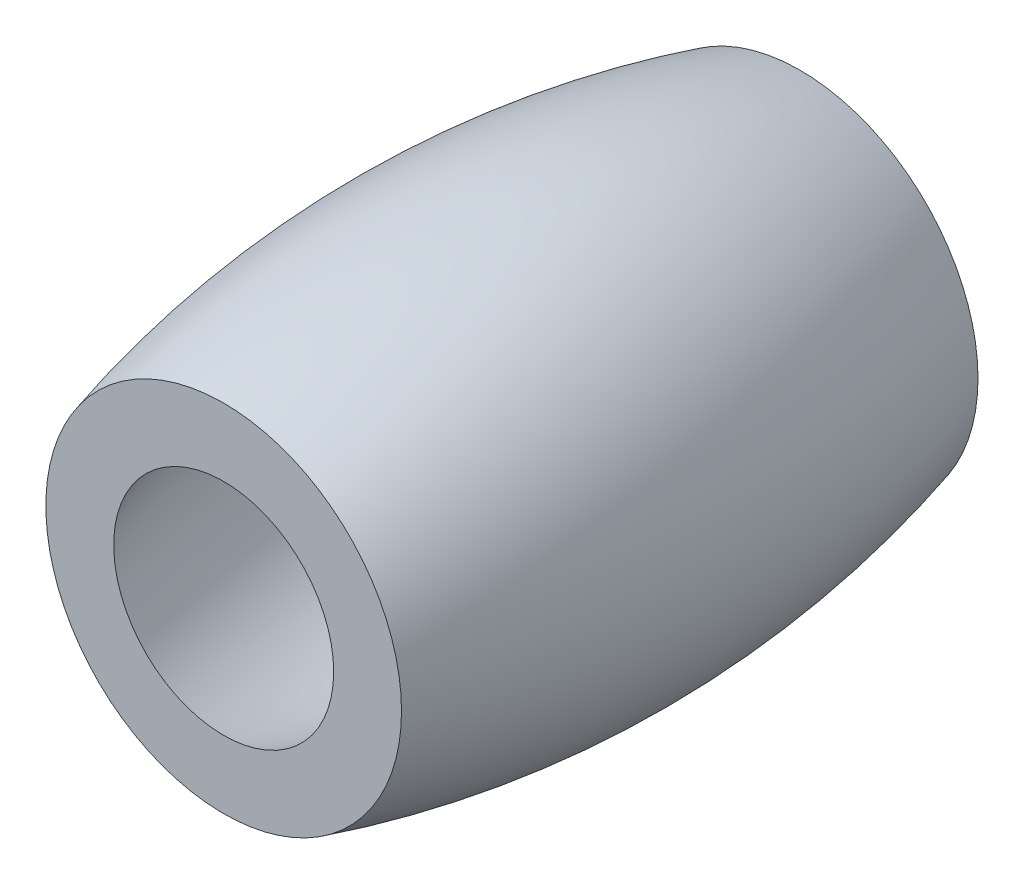
ISO-10303-21;
HEADER;
FILE_DESCRIPTION(('STEP AP214'),'2;1');
FILE_NAME('part.step','',(''),(''),'','','');
FILE_SCHEMA(('AUTOMOTIVE_DESIGN { 1 0 10303 214 1 1 1 1 }'));
ENDSEC;
DATA;
#1=APPLICATION_CONTEXT('core data for automotive mechanical design processes');
#2=APPLICATION_PROTOCOL_DEFINITION('international standard','automotive_design',2000,#1);
#3=PRODUCT_CONTEXT('',#1,'mechanical');
#4=PRODUCT('Part','Part','',(#3));
#5=PRODUCT_RELATED_PRODUCT_CATEGORY('part','',(#4));
#6=PRODUCT_DEFINITION_FORMATION('','',#4);
#7=PRODUCT_DEFINITION_CONTEXT('part definition',#1,'design');
#8=PRODUCT_DEFINITION('design','',#6,#7);
#9=PRODUCT_DEFINITION_SHAPE('','',#8);
#10=(LENGTH_UNIT() NAMED_UNIT(*) SI_UNIT(.MILLI.,.METRE.));
#11=(NAMED_UNIT(*) PLANE_ANGLE_UNIT() SI_UNIT($,.RADIAN.));
#12=(NAMED_UNIT(*) SI_UNIT($,.STERADIAN.) SOLID_ANGLE_UNIT());
#13=UNCERTAINTY_MEASURE_WITH_UNIT(LENGTH_MEASURE(1.E-05),#10,'distance_accuracy_value','');
#14=(GEOMETRIC_REPRESENTATION_CONTEXT(3) GLOBAL_UNCERTAINTY_ASSIGNED_CONTEXT((#13)) GLOBAL_UNIT_ASSIGNED_CONTEXT((#10,
#11,#12)) REPRESENTATION_CONTEXT('',''));
#15=CARTESIAN_POINT('',(0.,0.,0.));
#16=DIRECTION('',(0.,0.,1.));
#17=DIRECTION('',(1.,0.,0.));
#18=AXIS2_PLACEMENT_3D('',#15,#16,#17);
#19=CARTESIAN_POINT('',(0.,25.43,0.));
#20=DIRECTION('',(0.,0.,1.));
#21=DIRECTION('',(1.,0.,0.));
#22=AXIS2_PLACEMENT_3D('',#19,#20,#21);
#23=DEGENERATE_TOROIDAL_SURFACE('',#22,25.4300000000001,31.8300000000001,.F.);
#24=CARTESIAN_POINT('',(0.,25.43,8.50000000000001));
#25=DIRECTION('',(0.,0.,1.));
#26=DIRECTION('',(1.,0.,0.));
#27=AXIS2_PLACEMENT_3D('',#24,#25,#26);
#28=CIRCLE('',#27,5.24407537318769);
#29=CARTESIAN_POINT('',(5.24407537318769,25.43,8.50000000000001));
#30=VERTEX_POINT('',#29);
#31=EDGE_CURVE('E56',#30,#30,#28,.T.);
#32=ORIENTED_EDGE('',*,*,#31,.F.);
#33=EDGE_LOOP('',(#32));
#34=FACE_BOUND('',#33,.T.);
#35=CARTESIAN_POINT('',(0.,25.43,-8.49999999999999));
#36=DIRECTION('',(0.,0.,1.));
#37=DIRECTION('',(1.,0.,0.));
#38=AXIS2_PLACEMENT_3D('',#35,#36,#37);
#39=CIRCLE('',#38,5.24407537318769);
#40=CARTESIAN_POINT('',(5.24407537318769,25.43,-8.49999999999999));
#41=VERTEX_POINT('',#40);
#42=EDGE_CURVE('E12',#41,#41,#39,.T.);
#43=ORIENTED_EDGE('',*,*,#42,.T.);
#44=EDGE_LOOP('',(#43));
#45=FACE_BOUND('',#44,.T.);
#46=ADVANCED_FACE('F42',(#34,#45),#23,.F.);
#47=CARTESIAN_POINT('',(0.,30.6740753731877,-8.49999999999999));
#48=DIRECTION('',(0.,0.,1.));
#49=DIRECTION('',(1.,0.,0.));
#50=AXIS2_PLACEMENT_3D('',#47,#48,#49);
#51=PLANE('',#50);
#52=ORIENTED_EDGE('',*,*,#42,.F.);
#53=EDGE_LOOP('',(#52));
#54=FACE_BOUND('',#53,.T.);
#55=CARTESIAN_POINT('',(0.,25.43,-8.49999999999999));
#56=DIRECTION('',(0.,0.,1.));
#57=DIRECTION('',(1.,0.,0.));
#58=AXIS2_PLACEMENT_3D('',#55,#56,#57);
#59=CIRCLE('',#58,3.24407537318769);
#60=CARTESIAN_POINT('',(3.24407537318769,25.43,-8.49999999999999));
#61=VERTEX_POINT('',#60);
#62=EDGE_CURVE('E48',#61,#61,#59,.T.);
#63=ORIENTED_EDGE('',*,*,#62,.T.);
#64=EDGE_LOOP('',(#63));
#65=FACE_BOUND('',#64,.T.);
#66=ADVANCED_FACE('F65',(#54,#65),#51,.F.);
#67=CARTESIAN_POINT('',(0.,25.43,0.));
#68=DIRECTION('',(0.,0.,1.));
#69=DIRECTION('',(1.,0.,0.));
#70=AXIS2_PLACEMENT_3D('',#67,#68,#69);
#71=DEGENERATE_TOROIDAL_SURFACE('',#70,27.4299999999997,31.8299999999997,.F.);
#72=ORIENTED_EDGE('',*,*,#62,.F.);
#73=EDGE_LOOP('',(#72));
#74=FACE_BOUND('',#73,.T.);
#75=CARTESIAN_POINT('',(0.,25.43,8.50000000000001));
#76=DIRECTION('',(0.,0.,1.));
#77=DIRECTION('',(1.,0.,0.));
#78=AXIS2_PLACEMENT_3D('',#75,#76,#77);
#79=CIRCLE('',#78,3.24407537318768);
#80=CARTESIAN_POINT('',(3.24407537318768,25.43,8.50000000000001));
#81=VERTEX_POINT('',#80);
#82=EDGE_CURVE('E52',#81,#81,#79,.T.);
#83=ORIENTED_EDGE('',*,*,#82,.T.);
#84=EDGE_LOOP('',(#83));
#85=FACE_BOUND('',#84,.T.);
#86=ADVANCED_FACE('F69',(#74,#85),#71,.T.);
#87=CARTESIAN_POINT('',(0.,28.6740753731877,8.50000000000001));
#88=DIRECTION('',(0.,0.,-1.));
#89=DIRECTION('',(-1.,0.,0.));
#90=AXIS2_PLACEMENT_3D('',#87,#88,#89);
#91=PLANE('',#90);
#92=ORIENTED_EDGE('',*,*,#82,.F.);
#93=EDGE_LOOP('',(#92));
#94=FACE_BOUND('',#93,.T.);
#95=ORIENTED_EDGE('',*,*,#31,.T.);
#96=EDGE_LOOP('',(#95));
#97=FACE_BOUND('',#96,.T.);
#98=ADVANCED_FACE('F62',(#94,#97),#91,.F.);
#99=CLOSED_SHELL('',(#46,#66,#86,#98));
#100=MANIFOLD_SOLID_BREP('B2',#99);
#101=ADVANCED_BREP_SHAPE_REPRESENTATION('',(#18,#100),#14);
#102=SHAPE_DEFINITION_REPRESENTATION(#9,#101);
ENDSEC;
END-ISO-10303-21;
